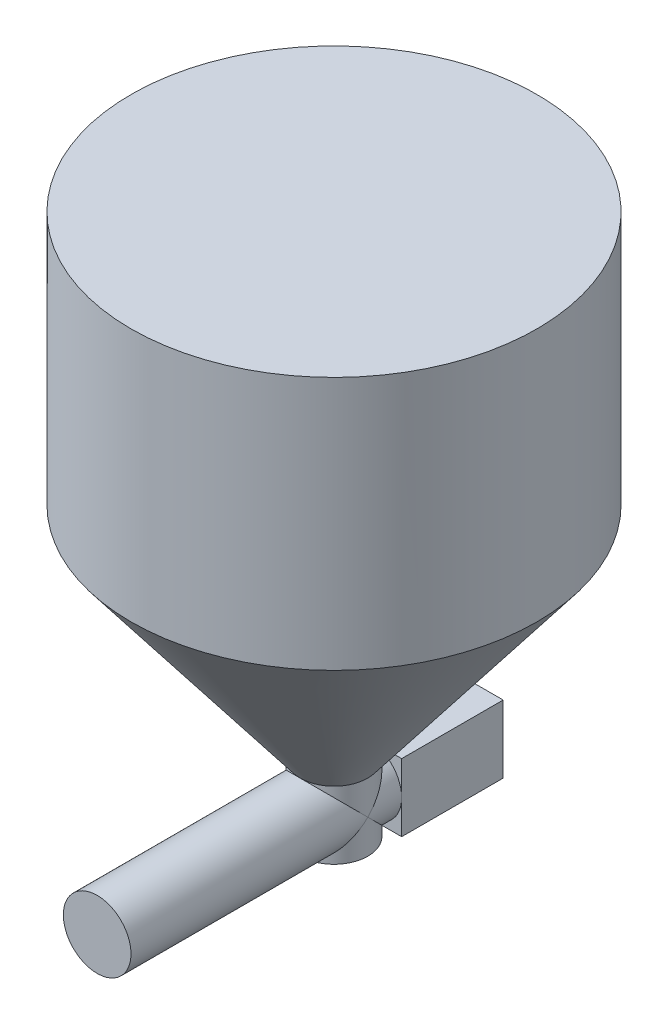
ISO-10303-21;
HEADER;
FILE_DESCRIPTION(('STEP AP214'),'2;1');
FILE_NAME('part.step','',(''),(''),'','','');
FILE_SCHEMA(('AUTOMOTIVE_DESIGN { 1 0 10303 214 1 1 1 1 }'));
ENDSEC;
DATA;
#1=APPLICATION_CONTEXT('core data for automotive mechanical design processes');
#2=APPLICATION_PROTOCOL_DEFINITION('international standard','automotive_design',2000,#1);
#3=PRODUCT_CONTEXT('',#1,'mechanical');
#4=PRODUCT('Part','Part','',(#3));
#5=PRODUCT_RELATED_PRODUCT_CATEGORY('part','',(#4));
#6=PRODUCT_DEFINITION_FORMATION('','',#4);
#7=PRODUCT_DEFINITION_CONTEXT('part definition',#1,'design');
#8=PRODUCT_DEFINITION('design','',#6,#7);
#9=PRODUCT_DEFINITION_SHAPE('','',#8);
#10=(LENGTH_UNIT() NAMED_UNIT(*) SI_UNIT(.MILLI.,.METRE.));
#11=(NAMED_UNIT(*) PLANE_ANGLE_UNIT() SI_UNIT($,.RADIAN.));
#12=(NAMED_UNIT(*) SI_UNIT($,.STERADIAN.) SOLID_ANGLE_UNIT());
#13=UNCERTAINTY_MEASURE_WITH_UNIT(LENGTH_MEASURE(1.E-05),#10,'distance_accuracy_value','');
#14=(GEOMETRIC_REPRESENTATION_CONTEXT(3) GLOBAL_UNCERTAINTY_ASSIGNED_CONTEXT((#13)) GLOBAL_UNIT_ASSIGNED_CONTEXT((#10,
#11,#12)) REPRESENTATION_CONTEXT('',''));
#15=CARTESIAN_POINT('',(0.,0.,0.));
#16=DIRECTION('',(0.,0.,1.));
#17=DIRECTION('',(1.,0.,0.));
#18=AXIS2_PLACEMENT_3D('',#15,#16,#17);
#19=CARTESIAN_POINT('',(0.,-800.,0.));
#20=DIRECTION('',(0.,1.,0.));
#21=DIRECTION('',(0.,0.,1.));
#22=AXIS2_PLACEMENT_3D('',#19,#20,#21);
#23=CYLINDRICAL_SURFACE('',#22,50.);
#24=CARTESIAN_POINT('',(0.,-750.,0.));
#25=DIRECTION('',(0.,0.707106781186547,-0.707106781186547));
#26=DIRECTION('',(0.,0.707106781186547,0.707106781186547));
#27=AXIS2_PLACEMENT_3D('',#24,#25,#26);
#28=ELLIPSE('',#27,70.7106781186548,50.);
#29=CARTESIAN_POINT('',(-2.22044604925031E-13,-700.,50.));
#30=VERTEX_POINT('',#29);
#31=CARTESIAN_POINT('',(50.,-750.,0.));
#32=VERTEX_POINT('',#31);
#33=EDGE_CURVE('E206',#30,#32,#28,.T.);
#34=ORIENTED_EDGE('',*,*,#33,.T.);
#35=CARTESIAN_POINT('',(0.,-750.,0.));
#36=DIRECTION('',(0.,0.707106781186547,0.707106781186547));
#37=DIRECTION('',(0.,0.707106781186547,-0.707106781186547));
#38=AXIS2_PLACEMENT_3D('',#35,#36,#37);
#39=ELLIPSE('',#38,70.7106781186548,50.);
#40=CARTESIAN_POINT('',(0.,-700.,-50.));
#41=VERTEX_POINT('',#40);
#42=EDGE_CURVE('E201',#32,#41,#39,.T.);
#43=ORIENTED_EDGE('',*,*,#42,.T.);
#44=CARTESIAN_POINT('',(0.,-700.,0.));
#45=DIRECTION('',(0.,-1.,0.));
#46=DIRECTION('',(0.,0.,-1.));
#47=AXIS2_PLACEMENT_3D('',#44,#45,#46);
#48=CIRCLE('',#47,50.);
#49=EDGE_CURVE('E226',#41,#30,#48,.T.);
#50=ORIENTED_EDGE('',*,*,#49,.T.);
#51=EDGE_LOOP('',(#34,#43,#50));
#52=FACE_BOUND('',#51,.T.);
#53=ADVANCED_FACE('F36',(#52),#23,.T.);
#54=CARTESIAN_POINT('',(0.,-375.,0.));
#55=DIRECTION('',(0.,1.,0.));
#56=DIRECTION('',(0.,0.,1.));
#57=AXIS2_PLACEMENT_3D('',#54,#55,#56);
#58=CYLINDRICAL_SURFACE('',#57,300.);
#59=CARTESIAN_POINT('',(0.,-375.,0.));
#60=DIRECTION('',(0.,-1.,0.));
#61=DIRECTION('',(0.,0.,-1.));
#62=AXIS2_PLACEMENT_3D('',#59,#60,#61);
#63=CIRCLE('',#62,300.);
#64=CARTESIAN_POINT('',(0.,-375.,-300.));
#65=VERTEX_POINT('',#64);
#66=EDGE_CURVE('E46',#65,#65,#63,.T.);
#67=ORIENTED_EDGE('',*,*,#66,.F.);
#68=EDGE_LOOP('',(#67));
#69=FACE_BOUND('',#68,.T.);
#70=CARTESIAN_POINT('',(0.,0.,0.));
#71=DIRECTION('',(0.,1.,0.));
#72=DIRECTION('',(0.,0.,1.));
#73=AXIS2_PLACEMENT_3D('',#70,#71,#72);
#74=CIRCLE('',#73,300.);
#75=CARTESIAN_POINT('',(0.,0.,300.));
#76=VERTEX_POINT('',#75);
#77=EDGE_CURVE('E12',#76,#76,#74,.T.);
#78=ORIENTED_EDGE('',*,*,#77,.F.);
#79=EDGE_LOOP('',(#78));
#80=FACE_BOUND('',#79,.T.);
#81=ADVANCED_FACE('F38',(#69,#80),#58,.T.);
#82=CARTESIAN_POINT('',(0.,0.,0.));
#83=DIRECTION('',(0.,1.,0.));
#84=DIRECTION('',(0.,0.,1.));
#85=AXIS2_PLACEMENT_3D('',#82,#83,#84);
#86=PLANE('',#85);
#87=ORIENTED_EDGE('',*,*,#77,.T.);
#88=EDGE_LOOP('',(#87));
#89=FACE_BOUND('',#88,.T.);
#90=ADVANCED_FACE('F242',(#89),#86,.T.);
#91=CARTESIAN_POINT('',(0.,-700.,0.));
#92=DIRECTION('',(0.,1.,0.));
#93=DIRECTION('',(0.,0.,1.));
#94=AXIS2_PLACEMENT_3D('',#91,#92,#93);
#95=CONICAL_SURFACE('',#94,50.,0.655695626241536);
#96=ORIENTED_EDGE('',*,*,#49,.F.);
#97=CARTESIAN_POINT('',(0.,-700.,0.));
#98=DIRECTION('',(0.,-1.,0.));
#99=DIRECTION('',(0.,0.,1.));
#100=AXIS2_PLACEMENT_3D('',#97,#98,#99);
#101=CIRCLE('',#100,50.);
#102=EDGE_CURVE('E276',#30,#41,#101,.T.);
#103=ORIENTED_EDGE('',*,*,#102,.F.);
#104=EDGE_LOOP('',(#96,#103));
#105=FACE_BOUND('',#104,.T.);
#106=ORIENTED_EDGE('',*,*,#66,.T.);
#107=EDGE_LOOP('',(#106));
#108=FACE_BOUND('',#107,.T.);
#109=ADVANCED_FACE('F232',(#105,#108),#95,.T.);
#110=CARTESIAN_POINT('',(-50.,-750.,0.));
#111=VERTEX_POINT('',#110);
#112=EDGE_CURVE('E197',#41,#111,#39,.T.);
#113=ORIENTED_EDGE('',*,*,#112,.T.);
#114=EDGE_CURVE('E209',#111,#30,#28,.T.);
#115=ORIENTED_EDGE('',*,*,#114,.T.);
#116=ORIENTED_EDGE('',*,*,#102,.T.);
#117=EDGE_LOOP('',(#113,#115,#116));
#118=FACE_BOUND('',#117,.T.);
#119=ADVANCED_FACE('F241',(#118),#23,.T.);
#120=CARTESIAN_POINT('',(0.,-750.,350.));
#121=DIRECTION('',(0.,0.,-1.));
#122=DIRECTION('',(-1.,0.,0.));
#123=AXIS2_PLACEMENT_3D('',#120,#121,#122);
#124=PLANE('',#123);
#125=CARTESIAN_POINT('',(0.,-750.,350.));
#126=DIRECTION('',(0.,0.,-1.));
#127=DIRECTION('',(-1.,0.,0.));
#128=AXIS2_PLACEMENT_3D('',#125,#126,#127);
#129=CIRCLE('',#128,50.);
#130=CARTESIAN_POINT('',(-50.,-750.,350.));
#131=VERTEX_POINT('',#130);
#132=EDGE_CURVE('E187',#131,#131,#129,.T.);
#133=ORIENTED_EDGE('',*,*,#132,.F.);
#134=EDGE_LOOP('',(#133));
#135=FACE_BOUND('',#134,.T.);
#136=ADVANCED_FACE('F267',(#135),#124,.F.);
#137=CARTESIAN_POINT('',(0.,-750.,350.));
#138=DIRECTION('',(0.,0.,-1.));
#139=DIRECTION('',(-1.,0.,0.));
#140=AXIS2_PLACEMENT_3D('',#137,#138,#139);
#141=CYLINDRICAL_SURFACE('',#140,50.);
#142=ORIENTED_EDGE('',*,*,#132,.T.);
#143=EDGE_LOOP('',(#142));
#144=FACE_BOUND('',#143,.T.);
#145=CARTESIAN_POINT('',(0.,-750.,0.));
#146=DIRECTION('',(0.,0.707106781186547,0.707106781186547));
#147=DIRECTION('',(0.,0.707106781186547,-0.707106781186547));
#148=AXIS2_PLACEMENT_3D('',#145,#146,#147);
#149=ELLIPSE('',#148,70.7106781186548,50.);
#150=CARTESIAN_POINT('',(0.,-800.,50.));
#151=VERTEX_POINT('',#150);
#152=EDGE_CURVE('E198',#32,#151,#149,.F.);
#153=ORIENTED_EDGE('',*,*,#152,.F.);
#154=ORIENTED_EDGE('',*,*,#33,.F.);
#155=ORIENTED_EDGE('',*,*,#114,.F.);
#156=EDGE_CURVE('E62',#151,#111,#149,.F.);
#157=ORIENTED_EDGE('',*,*,#156,.F.);
#158=EDGE_LOOP('',(#153,#154,#155,#157));
#159=FACE_BOUND('',#158,.T.);
#160=ADVANCED_FACE('F272',(#144,#159),#141,.T.);
#161=CARTESIAN_POINT('',(0.,-750.,0.));
#162=DIRECTION('',(0.,0.707106781186547,-0.707106781186547));
#163=DIRECTION('',(0.,0.707106781186547,0.707106781186547));
#164=AXIS2_PLACEMENT_3D('',#161,#162,#163);
#165=ELLIPSE('',#164,70.7106781186548,50.);
#166=CARTESIAN_POINT('',(0.,-800.,-50.));
#167=VERTEX_POINT('',#166);
#168=EDGE_CURVE('E218',#111,#167,#165,.F.);
#169=ORIENTED_EDGE('',*,*,#168,.F.);
#170=ORIENTED_EDGE('',*,*,#112,.F.);
#171=CARTESIAN_POINT('',(0.,-750.,-50.));
#172=DIRECTION('',(0.,0.,-1.));
#173=DIRECTION('',(-1.,0.,0.));
#174=AXIS2_PLACEMENT_3D('',#171,#172,#173);
#175=CIRCLE('',#174,50.);
#176=CARTESIAN_POINT('',(-50.,-750.,-50.));
#177=VERTEX_POINT('',#176);
#178=EDGE_CURVE('E54',#41,#177,#175,.F.);
#179=ORIENTED_EDGE('',*,*,#178,.T.);
#180=CARTESIAN_POINT('',(0.,-750.,-50.));
#181=DIRECTION('',(0.,0.,-1.));
#182=DIRECTION('',(-1.,0.,0.));
#183=AXIS2_PLACEMENT_3D('',#180,#181,#182);
#184=CIRCLE('',#183,50.);
#185=EDGE_CURVE('E175',#167,#177,#184,.T.);
#186=ORIENTED_EDGE('',*,*,#185,.F.);
#187=EDGE_LOOP('',(#169,#170,#179,#186));
#188=FACE_BOUND('',#187,.T.);
#189=ADVANCED_FACE('F277',(#188),#141,.T.);
#190=EDGE_CURVE('E215',#167,#32,#165,.F.);
#191=ORIENTED_EDGE('',*,*,#190,.F.);
#192=CARTESIAN_POINT('',(0.,-750.,-50.));
#193=DIRECTION('',(0.,0.,-1.));
#194=DIRECTION('',(-1.,0.,0.));
#195=AXIS2_PLACEMENT_3D('',#192,#193,#194);
#196=CIRCLE('',#195,50.);
#197=CARTESIAN_POINT('',(50.,-750.,-50.));
#198=VERTEX_POINT('',#197);
#199=EDGE_CURVE('E133',#167,#198,#196,.F.);
#200=ORIENTED_EDGE('',*,*,#199,.T.);
#201=EDGE_CURVE('E177',#41,#198,#184,.T.);
#202=ORIENTED_EDGE('',*,*,#201,.F.);
#203=ORIENTED_EDGE('',*,*,#42,.F.);
#204=EDGE_LOOP('',(#191,#200,#202,#203));
#205=FACE_BOUND('',#204,.T.);
#206=ADVANCED_FACE('F264',(#205),#141,.T.);
#207=CARTESIAN_POINT('',(0.,-800.,0.));
#208=DIRECTION('',(0.,-1.,0.));
#209=DIRECTION('',(0.,0.,-1.));
#210=AXIS2_PLACEMENT_3D('',#207,#208,#209);
#211=PLANE('',#210);
#212=CARTESIAN_POINT('',(0.,-800.,0.));
#213=DIRECTION('',(0.,-1.,0.));
#214=DIRECTION('',(0.,0.,-1.));
#215=AXIS2_PLACEMENT_3D('',#212,#213,#214);
#216=CIRCLE('',#215,50.);
#217=EDGE_CURVE('E222',#151,#167,#216,.T.);
#218=ORIENTED_EDGE('',*,*,#217,.T.);
#219=EDGE_CURVE('E219',#167,#151,#216,.T.);
#220=ORIENTED_EDGE('',*,*,#219,.T.);
#221=EDGE_LOOP('',(#218,#220));
#222=FACE_BOUND('',#221,.T.);
#223=ADVANCED_FACE('F260',(#222),#211,.T.);
#224=ORIENTED_EDGE('',*,*,#156,.T.);
#225=ORIENTED_EDGE('',*,*,#168,.T.);
#226=ORIENTED_EDGE('',*,*,#217,.F.);
#227=EDGE_LOOP('',(#224,#225,#226));
#228=FACE_BOUND('',#227,.T.);
#229=ADVANCED_FACE('F254',(#228),#23,.T.);
#230=ORIENTED_EDGE('',*,*,#190,.T.);
#231=ORIENTED_EDGE('',*,*,#152,.T.);
#232=ORIENTED_EDGE('',*,*,#219,.F.);
#233=EDGE_LOOP('',(#230,#231,#232));
#234=FACE_BOUND('',#233,.T.);
#235=ADVANCED_FACE('F253',(#234),#23,.T.);
#236=CARTESIAN_POINT('',(0.,0.,-50.));
#237=DIRECTION('',(0.,0.,-1.));
#238=DIRECTION('',(-1.,0.,0.));
#239=AXIS2_PLACEMENT_3D('',#236,#237,#238);
#240=PLANE('',#239);
#241=ORIENTED_EDGE('',*,*,#185,.T.);
#242=DIRECTION('',(0.,1.,0.));
#243=VECTOR('',#242,1.);
#244=CARTESIAN_POINT('',(-50.,-700.,-50.));
#245=LINE('',#244,#243);
#246=CARTESIAN_POINT('',(-50.,-800.,-50.));
#247=VERTEX_POINT('',#246);
#248=EDGE_CURVE('E144',#247,#177,#245,.T.);
#249=ORIENTED_EDGE('',*,*,#248,.F.);
#250=DIRECTION('',(-1.,0.,0.));
#251=VECTOR('',#250,1.);
#252=CARTESIAN_POINT('',(50.,-800.,-50.));
#253=LINE('',#252,#251);
#254=EDGE_CURVE('E153',#167,#247,#253,.T.);
#255=ORIENTED_EDGE('',*,*,#254,.F.);
#256=EDGE_LOOP('',(#241,#249,#255));
#257=FACE_BOUND('',#256,.T.);
#258=ADVANCED_FACE('F174',(#257),#240,.F.);
#259=ORIENTED_EDGE('',*,*,#178,.F.);
#260=DIRECTION('',(1.,0.,0.));
#261=VECTOR('',#260,1.);
#262=CARTESIAN_POINT('',(50.,-700.,-50.));
#263=LINE('',#262,#261);
#264=CARTESIAN_POINT('',(-50.,-700.,-50.));
#265=VERTEX_POINT('',#264);
#266=EDGE_CURVE('E143',#265,#41,#263,.T.);
#267=ORIENTED_EDGE('',*,*,#266,.F.);
#268=EDGE_CURVE('E131',#177,#265,#245,.T.);
#269=ORIENTED_EDGE('',*,*,#268,.F.);
#270=EDGE_LOOP('',(#259,#267,#269));
#271=FACE_BOUND('',#270,.T.);
#272=ADVANCED_FACE('F180',(#271),#240,.F.);
#273=ORIENTED_EDGE('',*,*,#199,.F.);
#274=CARTESIAN_POINT('',(50.,-800.,-50.));
#275=VERTEX_POINT('',#274);
#276=EDGE_CURVE('E126',#275,#167,#253,.T.);
#277=ORIENTED_EDGE('',*,*,#276,.F.);
#278=DIRECTION('',(0.,-1.,0.));
#279=VECTOR('',#278,1.);
#280=CARTESIAN_POINT('',(50.,-700.,-50.));
#281=LINE('',#280,#279);
#282=EDGE_CURVE('E154',#198,#275,#281,.T.);
#283=ORIENTED_EDGE('',*,*,#282,.F.);
#284=EDGE_LOOP('',(#273,#277,#283));
#285=FACE_BOUND('',#284,.T.);
#286=ADVANCED_FACE('F167',(#285),#240,.F.);
#287=CARTESIAN_POINT('',(-50.,-700.,-200.));
#288=DIRECTION('',(1.,0.,0.));
#289=DIRECTION('',(0.,1.,0.));
#290=AXIS2_PLACEMENT_3D('',#287,#288,#289);
#291=PLANE('',#290);
#292=ORIENTED_EDGE('',*,*,#248,.T.);
#293=ORIENTED_EDGE('',*,*,#268,.T.);
#294=DIRECTION('',(0.,0.,1.));
#295=VECTOR('',#294,1.);
#296=CARTESIAN_POINT('',(-50.,-700.,-200.));
#297=LINE('',#296,#295);
#298=CARTESIAN_POINT('',(-50.,-700.,-200.));
#299=VERTEX_POINT('',#298);
#300=EDGE_CURVE('E111',#299,#265,#297,.T.);
#301=ORIENTED_EDGE('',*,*,#300,.F.);
#302=DIRECTION('',(0.,1.,0.));
#303=VECTOR('',#302,1.);
#304=CARTESIAN_POINT('',(-50.,-700.,-200.));
#305=LINE('',#304,#303);
#306=CARTESIAN_POINT('',(-50.,-800.,-200.));
#307=VERTEX_POINT('',#306);
#308=EDGE_CURVE('E117',#307,#299,#305,.T.);
#309=ORIENTED_EDGE('',*,*,#308,.F.);
#310=DIRECTION('',(0.,0.,1.));
#311=VECTOR('',#310,1.);
#312=CARTESIAN_POINT('',(-50.,-800.,-200.));
#313=LINE('',#312,#311);
#314=EDGE_CURVE('E157',#307,#247,#313,.T.);
#315=ORIENTED_EDGE('',*,*,#314,.T.);
#316=EDGE_LOOP('',(#292,#293,#301,#309,#315));
#317=FACE_BOUND('',#316,.T.);
#318=ADVANCED_FACE('F129',(#317),#291,.F.);
#319=CARTESIAN_POINT('',(50.,-700.,-200.));
#320=DIRECTION('',(0.,-1.,0.));
#321=DIRECTION('',(0.,0.,-1.));
#322=AXIS2_PLACEMENT_3D('',#319,#320,#321);
#323=PLANE('',#322);
#324=ORIENTED_EDGE('',*,*,#266,.T.);
#325=CARTESIAN_POINT('',(50.,-700.,-50.));
#326=VERTEX_POINT('',#325);
#327=EDGE_CURVE('E140',#41,#326,#263,.T.);
#328=ORIENTED_EDGE('',*,*,#327,.T.);
#329=DIRECTION('',(0.,0.,1.));
#330=VECTOR('',#329,1.);
#331=CARTESIAN_POINT('',(50.,-700.,-200.));
#332=LINE('',#331,#330);
#333=CARTESIAN_POINT('',(50.,-700.,-200.));
#334=VERTEX_POINT('',#333);
#335=EDGE_CURVE('E113',#334,#326,#332,.T.);
#336=ORIENTED_EDGE('',*,*,#335,.F.);
#337=DIRECTION('',(1.,0.,0.));
#338=VECTOR('',#337,1.);
#339=CARTESIAN_POINT('',(50.,-700.,-200.));
#340=LINE('',#339,#338);
#341=EDGE_CURVE('E106',#299,#334,#340,.T.);
#342=ORIENTED_EDGE('',*,*,#341,.F.);
#343=ORIENTED_EDGE('',*,*,#300,.T.);
#344=EDGE_LOOP('',(#324,#328,#336,#342,#343));
#345=FACE_BOUND('',#344,.T.);
#346=ADVANCED_FACE('F109',(#345),#323,.F.);
#347=CARTESIAN_POINT('',(50.,-700.,-200.));
#348=DIRECTION('',(-1.,0.,0.));
#349=DIRECTION('',(0.,-1.,0.));
#350=AXIS2_PLACEMENT_3D('',#347,#348,#349);
#351=PLANE('',#350);
#352=EDGE_CURVE('E149',#326,#198,#281,.T.);
#353=ORIENTED_EDGE('',*,*,#352,.T.);
#354=ORIENTED_EDGE('',*,*,#282,.T.);
#355=DIRECTION('',(0.,0.,1.));
#356=VECTOR('',#355,1.);
#357=CARTESIAN_POINT('',(50.,-800.,-200.));
#358=LINE('',#357,#356);
#359=CARTESIAN_POINT('',(50.,-800.,-200.));
#360=VERTEX_POINT('',#359);
#361=EDGE_CURVE('E136',#360,#275,#358,.T.);
#362=ORIENTED_EDGE('',*,*,#361,.F.);
#363=DIRECTION('',(0.,-1.,0.));
#364=VECTOR('',#363,1.);
#365=CARTESIAN_POINT('',(50.,-700.,-200.));
#366=LINE('',#365,#364);
#367=EDGE_CURVE('E116',#334,#360,#366,.T.);
#368=ORIENTED_EDGE('',*,*,#367,.F.);
#369=ORIENTED_EDGE('',*,*,#335,.T.);
#370=EDGE_LOOP('',(#353,#354,#362,#368,#369));
#371=FACE_BOUND('',#370,.T.);
#372=ADVANCED_FACE('F182',(#371),#351,.F.);
#373=CARTESIAN_POINT('',(50.,-800.,-200.));
#374=DIRECTION('',(0.,1.,0.));
#375=DIRECTION('',(0.,0.,1.));
#376=AXIS2_PLACEMENT_3D('',#373,#374,#375);
#377=PLANE('',#376);
#378=ORIENTED_EDGE('',*,*,#276,.T.);
#379=ORIENTED_EDGE('',*,*,#254,.T.);
#380=ORIENTED_EDGE('',*,*,#314,.F.);
#381=DIRECTION('',(-1.,0.,0.));
#382=VECTOR('',#381,1.);
#383=CARTESIAN_POINT('',(50.,-800.,-200.));
#384=LINE('',#383,#382);
#385=EDGE_CURVE('E122',#360,#307,#384,.T.);
#386=ORIENTED_EDGE('',*,*,#385,.F.);
#387=ORIENTED_EDGE('',*,*,#361,.T.);
#388=EDGE_LOOP('',(#378,#379,#380,#386,#387));
#389=FACE_BOUND('',#388,.T.);
#390=ADVANCED_FACE('F162',(#389),#377,.F.);
#391=CARTESIAN_POINT('',(0.,0.,-200.));
#392=DIRECTION('',(0.,0.,-1.));
#393=DIRECTION('',(-1.,0.,0.));
#394=AXIS2_PLACEMENT_3D('',#391,#392,#393);
#395=PLANE('',#394);
#396=ORIENTED_EDGE('',*,*,#308,.T.);
#397=ORIENTED_EDGE('',*,*,#341,.T.);
#398=ORIENTED_EDGE('',*,*,#367,.T.);
#399=ORIENTED_EDGE('',*,*,#385,.T.);
#400=EDGE_LOOP('',(#396,#397,#398,#399));
#401=FACE_BOUND('',#400,.T.);
#402=ADVANCED_FACE('F120',(#401),#395,.T.);
#403=ORIENTED_EDGE('',*,*,#201,.T.);
#404=ORIENTED_EDGE('',*,*,#352,.F.);
#405=ORIENTED_EDGE('',*,*,#327,.F.);
#406=EDGE_LOOP('',(#403,#404,#405));
#407=FACE_BOUND('',#406,.T.);
#408=ADVANCED_FACE('F185',(#407),#240,.F.);
#409=CLOSED_SHELL('',(#53,#81,#90,#109,#119,#136,#160,#189,#206,#223,#229,#235,#258,#272,#286,
#318,#346,#372,#390,#402,#408));
#410=MANIFOLD_SOLID_BREP('B2',#409);
#411=ADVANCED_BREP_SHAPE_REPRESENTATION('',(#18,#410),#14);
#412=SHAPE_DEFINITION_REPRESENTATION(#9,#411);
ENDSEC;
END-ISO-10303-21;
